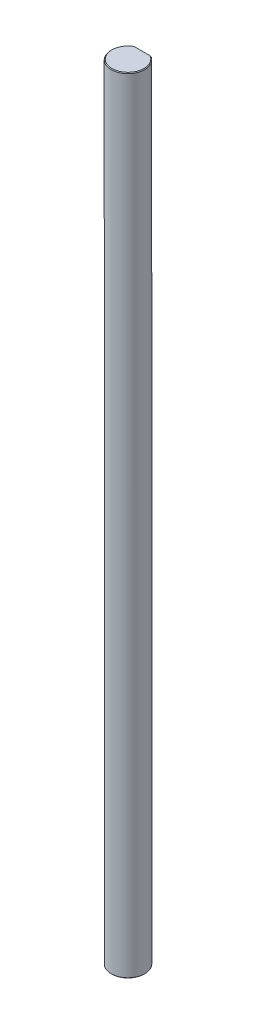
ISO-10303-21;
HEADER;
FILE_DESCRIPTION(('STEP AP214'),'2;1');
FILE_NAME('part.step','',(''),(''),'','','');
FILE_SCHEMA(('AUTOMOTIVE_DESIGN { 1 0 10303 214 1 1 1 1 }'));
ENDSEC;
DATA;
#1=APPLICATION_CONTEXT('core data for automotive mechanical design processes');
#2=APPLICATION_PROTOCOL_DEFINITION('international standard','automotive_design',2000,#1);
#3=PRODUCT_CONTEXT('',#1,'mechanical');
#4=PRODUCT('Part','Part','',(#3));
#5=PRODUCT_RELATED_PRODUCT_CATEGORY('part','',(#4));
#6=PRODUCT_DEFINITION_FORMATION('','',#4);
#7=PRODUCT_DEFINITION_CONTEXT('part definition',#1,'design');
#8=PRODUCT_DEFINITION('design','',#6,#7);
#9=PRODUCT_DEFINITION_SHAPE('','',#8);
#10=(LENGTH_UNIT() NAMED_UNIT(*) SI_UNIT(.MILLI.,.METRE.));
#11=(NAMED_UNIT(*) PLANE_ANGLE_UNIT() SI_UNIT($,.RADIAN.));
#12=(NAMED_UNIT(*) SI_UNIT($,.STERADIAN.) SOLID_ANGLE_UNIT());
#13=UNCERTAINTY_MEASURE_WITH_UNIT(LENGTH_MEASURE(1.E-05),#10,'distance_accuracy_value','');
#14=(GEOMETRIC_REPRESENTATION_CONTEXT(3) GLOBAL_UNCERTAINTY_ASSIGNED_CONTEXT((#13)) GLOBAL_UNIT_ASSIGNED_CONTEXT((#10,
#11,#12)) REPRESENTATION_CONTEXT('',''));
#15=CARTESIAN_POINT('',(0.,0.,0.));
#16=DIRECTION('',(0.,0.,1.));
#17=DIRECTION('',(1.,0.,0.));
#18=AXIS2_PLACEMENT_3D('',#15,#16,#17);
#19=CARTESIAN_POINT('',(0.,0.125000000000042,0.));
#20=DIRECTION('',(0.,1.,0.));
#21=DIRECTION('',(0.,0.,1.));
#22=AXIS2_PLACEMENT_3D('',#19,#20,#21);
#23=CONICAL_SURFACE('',#22,3.,0.785398163397383);
#24=CARTESIAN_POINT('',(0.,0.,0.));
#25=DIRECTION('',(0.,-1.,0.));
#26=DIRECTION('',(0.,0.,1.));
#27=AXIS2_PLACEMENT_3D('',#24,#25,#26);
#28=CIRCLE('',#27,2.875);
#29=CARTESIAN_POINT('',(0.,0.,2.875));
#30=VERTEX_POINT('',#29);
#31=CARTESIAN_POINT('',(-1.41972708645002,0.,-2.5));
#32=VERTEX_POINT('',#31);
#33=EDGE_CURVE('E40',#30,#32,#28,.T.);
#34=ORIENTED_EDGE('',*,*,#33,.F.);
#35=DIRECTION('',(0.,0.707106781186594,0.707106781186501));
#36=VECTOR('',#35,1.);
#37=CARTESIAN_POINT('',(0.,0.125000000000042,3.));
#38=LINE('',#37,#36);
#39=CARTESIAN_POINT('',(0.,0.125000000000042,3.));
#40=VERTEX_POINT('',#39);
#41=EDGE_CURVE('E9',#30,#40,#38,.T.);
#42=ORIENTED_EDGE('',*,*,#41,.T.);
#43=CARTESIAN_POINT('',(0.,0.125000000000042,0.));
#44=DIRECTION('',(0.,1.,0.));
#45=DIRECTION('',(0.,0.,1.));
#46=AXIS2_PLACEMENT_3D('',#43,#44,#45);
#47=CIRCLE('',#46,3.);
#48=CARTESIAN_POINT('',(-1.6583123951777,0.125000000000041,-2.5));
#49=VERTEX_POINT('',#48);
#50=EDGE_CURVE('E127',#49,#40,#47,.T.);
#51=ORIENTED_EDGE('',*,*,#50,.F.);
#52=CARTESIAN_POINT('',(-1.41972708645002,0.,-2.5));
#53=CARTESIAN_POINT('',(-1.50022900034235,0.0397533035353139,-2.5));
#54=CARTESIAN_POINT('',(-1.57973572193474,0.0815651095964806,-2.5));
#55=CARTESIAN_POINT('',(-1.6583123951777,0.125000000000041,-2.5));
#56=(BOUNDED_CURVE() B_SPLINE_CURVE(3,(#52,#53,#54,#55),.UNSPECIFIED.,.F.,
.F.) B_SPLINE_CURVE_WITH_KNOTS((4,4),(0.,0.000269347265701164),
.UNSPECIFIED.) CURVE() GEOMETRIC_REPRESENTATION_ITEM() RATIONAL_B_SPLINE_CURVE((1.,1.,1.,1.)) REPRESENTATION_ITEM(''));
#57=EDGE_CURVE('E96',#32,#49,#56,.T.);
#58=ORIENTED_EDGE('',*,*,#57,.F.);
#59=EDGE_LOOP('',(#34,#42,#51,#58));
#60=FACE_BOUND('',#59,.T.);
#61=ADVANCED_FACE('F15',(#60),#23,.T.);
#62=CARTESIAN_POINT('',(0.,140.,0.));
#63=DIRECTION('',(0.,-1.,0.));
#64=DIRECTION('',(0.,0.,-1.));
#65=AXIS2_PLACEMENT_3D('',#62,#63,#64);
#66=CYLINDRICAL_SURFACE('',#65,3.);
#67=DIRECTION('',(0.,-1.,0.));
#68=VECTOR('',#67,1.);
#69=CARTESIAN_POINT('',(-1.6583123951777,140.,-2.5));
#70=LINE('',#69,#68);
#71=CARTESIAN_POINT('',(-1.6583123951777,139.875,-2.5));
#72=VERTEX_POINT('',#71);
#73=EDGE_CURVE('E26',#72,#49,#70,.T.);
#74=ORIENTED_EDGE('',*,*,#73,.T.);
#75=ORIENTED_EDGE('',*,*,#50,.T.);
#76=CARTESIAN_POINT('',(0.,0.125000000000042,0.));
#77=DIRECTION('',(0.,1.,0.));
#78=DIRECTION('',(0.,0.,1.));
#79=AXIS2_PLACEMENT_3D('',#76,#77,#78);
#80=CIRCLE('',#79,3.);
#81=CARTESIAN_POINT('',(1.6583123951777,0.125000000000041,-2.5));
#82=VERTEX_POINT('',#81);
#83=EDGE_CURVE('E112',#40,#82,#80,.T.);
#84=ORIENTED_EDGE('',*,*,#83,.T.);
#85=DIRECTION('',(0.,-1.,0.));
#86=VECTOR('',#85,1.);
#87=CARTESIAN_POINT('',(1.6583123951777,140.,-2.5));
#88=LINE('',#87,#86);
#89=CARTESIAN_POINT('',(1.6583123951777,139.875,-2.5));
#90=VERTEX_POINT('',#89);
#91=EDGE_CURVE('E113',#90,#82,#88,.T.);
#92=ORIENTED_EDGE('',*,*,#91,.F.);
#93=CARTESIAN_POINT('',(0.,139.875,0.));
#94=DIRECTION('',(0.,-1.,0.));
#95=DIRECTION('',(0.,0.,1.));
#96=AXIS2_PLACEMENT_3D('',#93,#94,#95);
#97=CIRCLE('',#96,3.);
#98=EDGE_CURVE('E110',#90,#72,#97,.T.);
#99=ORIENTED_EDGE('',*,*,#98,.T.);
#100=EDGE_LOOP('',(#74,#75,#84,#92,#99));
#101=FACE_BOUND('',#100,.T.);
#102=ADVANCED_FACE('F155',(#101),#66,.T.);
#103=CARTESIAN_POINT('',(0.,140.,-2.5));
#104=DIRECTION('',(0.,0.,-1.));
#105=DIRECTION('',(0.,-1.,0.));
#106=AXIS2_PLACEMENT_3D('',#103,#104,#105);
#107=PLANE('',#106);
#108=ORIENTED_EDGE('',*,*,#91,.T.);
#109=CARTESIAN_POINT('',(1.6583123951777,0.125000000000041,-2.5));
#110=CARTESIAN_POINT('',(1.57973572193474,0.0815651095964929,-2.5));
#111=CARTESIAN_POINT('',(1.50022900034237,0.0397533035352896,-2.5));
#112=CARTESIAN_POINT('',(1.41972708645002,0.,-2.5));
#113=(BOUNDED_CURVE() B_SPLINE_CURVE(3,(#109,#110,#111,#112),.UNSPECIFIED.,.F.,
.F.) B_SPLINE_CURVE_WITH_KNOTS((4,4),(0.,0.000269347265701165),
.UNSPECIFIED.) CURVE() GEOMETRIC_REPRESENTATION_ITEM() RATIONAL_B_SPLINE_CURVE((1.,1.,1.,1.)) REPRESENTATION_ITEM(''));
#114=CARTESIAN_POINT('',(1.41972708645002,0.,-2.5));
#115=VERTEX_POINT('',#114);
#116=EDGE_CURVE('E114',#82,#115,#113,.T.);
#117=ORIENTED_EDGE('',*,*,#116,.T.);
#118=DIRECTION('',(1.,0.,0.));
#119=VECTOR('',#118,1.);
#120=CARTESIAN_POINT('',(0.,0.,-2.5));
#121=LINE('',#120,#119);
#122=EDGE_CURVE('E100',#32,#115,#121,.T.);
#123=ORIENTED_EDGE('',*,*,#122,.F.);
#124=ORIENTED_EDGE('',*,*,#57,.T.);
#125=ORIENTED_EDGE('',*,*,#73,.F.);
#126=CARTESIAN_POINT('',(-1.6583123951777,139.875,-2.5));
#127=CARTESIAN_POINT('',(-1.57973572193476,139.918434890403,-2.5));
#128=CARTESIAN_POINT('',(-1.5002290003424,139.960246696465,-2.5));
#129=CARTESIAN_POINT('',(-1.41972708645007,140.,-2.5));
#130=(BOUNDED_CURVE() B_SPLINE_CURVE(3,(#126,#127,#128,#129),.UNSPECIFIED.,.F.,
.F.) B_SPLINE_CURVE_WITH_KNOTS((4,4),(0.,0.000269347265701091),
.UNSPECIFIED.) CURVE() GEOMETRIC_REPRESENTATION_ITEM() RATIONAL_B_SPLINE_CURVE((1.,1.,1.,1.)) REPRESENTATION_ITEM(''));
#131=CARTESIAN_POINT('',(-1.41972708645007,140.,-2.5));
#132=VERTEX_POINT('',#131);
#133=EDGE_CURVE('E87',#72,#132,#130,.T.);
#134=ORIENTED_EDGE('',*,*,#133,.T.);
#135=DIRECTION('',(1.,0.,0.));
#136=VECTOR('',#135,1.);
#137=CARTESIAN_POINT('',(0.,140.,-2.5));
#138=LINE('',#137,#136);
#139=CARTESIAN_POINT('',(1.41972708645007,140.,-2.5));
#140=VERTEX_POINT('',#139);
#141=EDGE_CURVE('E81',#132,#140,#138,.T.);
#142=ORIENTED_EDGE('',*,*,#141,.T.);
#143=CARTESIAN_POINT('',(1.41972708645007,140.,-2.5));
#144=CARTESIAN_POINT('',(1.50022900034239,139.960246696465,-2.5));
#145=CARTESIAN_POINT('',(1.57973572193477,139.918434890403,-2.5));
#146=CARTESIAN_POINT('',(1.6583123951777,139.875,-2.5));
#147=(BOUNDED_CURVE() B_SPLINE_CURVE(3,(#143,#144,#145,#146),.UNSPECIFIED.,.F.,
.F.) B_SPLINE_CURVE_WITH_KNOTS((4,4),(0.,0.000269347265701092),
.UNSPECIFIED.) CURVE() GEOMETRIC_REPRESENTATION_ITEM() RATIONAL_B_SPLINE_CURVE((1.,1.,1.,1.)) REPRESENTATION_ITEM(''));
#148=EDGE_CURVE('E73',#140,#90,#147,.T.);
#149=ORIENTED_EDGE('',*,*,#148,.T.);
#150=EDGE_LOOP('',(#108,#117,#123,#124,#125,#134,#142,#149));
#151=FACE_BOUND('',#150,.T.);
#152=ADVANCED_FACE('F92',(#151),#107,.T.);
#153=CARTESIAN_POINT('',(0.,140.,0.));
#154=DIRECTION('',(0.,1.,0.));
#155=DIRECTION('',(1.,0.,0.));
#156=AXIS2_PLACEMENT_3D('',#153,#154,#155);
#157=PLANE('',#156);
#158=ORIENTED_EDGE('',*,*,#141,.F.);
#159=CARTESIAN_POINT('',(0.,140.,0.));
#160=DIRECTION('',(0.,1.,0.));
#161=DIRECTION('',(0.,0.,1.));
#162=AXIS2_PLACEMENT_3D('',#159,#160,#161);
#163=CIRCLE('',#162,2.875);
#164=EDGE_CURVE('E84',#132,#140,#163,.T.);
#165=ORIENTED_EDGE('',*,*,#164,.T.);
#166=EDGE_LOOP('',(#158,#165));
#167=FACE_BOUND('',#166,.T.);
#168=ADVANCED_FACE('F83',(#167),#157,.T.);
#169=CARTESIAN_POINT('',(0.,0.,0.));
#170=DIRECTION('',(0.,1.,0.));
#171=DIRECTION('',(1.,0.,0.));
#172=AXIS2_PLACEMENT_3D('',#169,#170,#171);
#173=PLANE('',#172);
#174=ORIENTED_EDGE('',*,*,#122,.T.);
#175=CARTESIAN_POINT('',(0.,0.,0.));
#176=DIRECTION('',(0.,-1.,0.));
#177=DIRECTION('',(0.,0.,1.));
#178=AXIS2_PLACEMENT_3D('',#175,#176,#177);
#179=CIRCLE('',#178,2.875);
#180=EDGE_CURVE('E19',#115,#30,#179,.T.);
#181=ORIENTED_EDGE('',*,*,#180,.T.);
#182=ORIENTED_EDGE('',*,*,#33,.T.);
#183=EDGE_LOOP('',(#174,#181,#182));
#184=FACE_BOUND('',#183,.T.);
#185=ADVANCED_FACE('F17',(#184),#173,.F.);
#186=CARTESIAN_POINT('',(0.,0.125000000000042,0.));
#187=DIRECTION('',(0.,1.,0.));
#188=DIRECTION('',(0.,0.,1.));
#189=AXIS2_PLACEMENT_3D('',#186,#187,#188);
#190=CONICAL_SURFACE('',#189,3.,0.785398163397383);
#191=ORIENTED_EDGE('',*,*,#41,.F.);
#192=ORIENTED_EDGE('',*,*,#180,.F.);
#193=ORIENTED_EDGE('',*,*,#116,.F.);
#194=ORIENTED_EDGE('',*,*,#83,.F.);
#195=EDGE_LOOP('',(#191,#192,#193,#194));
#196=FACE_BOUND('',#195,.T.);
#197=ADVANCED_FACE('F161',(#196),#190,.T.);
#198=CARTESIAN_POINT('',(0.,140.,0.));
#199=DIRECTION('',(0.,-1.,0.));
#200=DIRECTION('',(0.,0.,-1.));
#201=AXIS2_PLACEMENT_3D('',#198,#199,#200);
#202=CONICAL_SURFACE('',#201,2.875,0.785398163397495);
#203=ORIENTED_EDGE('',*,*,#133,.F.);
#204=ORIENTED_EDGE('',*,*,#98,.F.);
#205=ORIENTED_EDGE('',*,*,#148,.F.);
#206=ORIENTED_EDGE('',*,*,#164,.F.);
#207=EDGE_LOOP('',(#203,#204,#205,#206));
#208=FACE_BOUND('',#207,.T.);
#209=ADVANCED_FACE('F98',(#208),#202,.T.);
#210=CLOSED_SHELL('',(#61,#102,#152,#168,#185,#197,#209));
#211=MANIFOLD_SOLID_BREP('B1',#210);
#212=ADVANCED_BREP_SHAPE_REPRESENTATION('',(#18,#211),#14);
#213=SHAPE_DEFINITION_REPRESENTATION(#9,#212);
ENDSEC;
END-ISO-10303-21;
